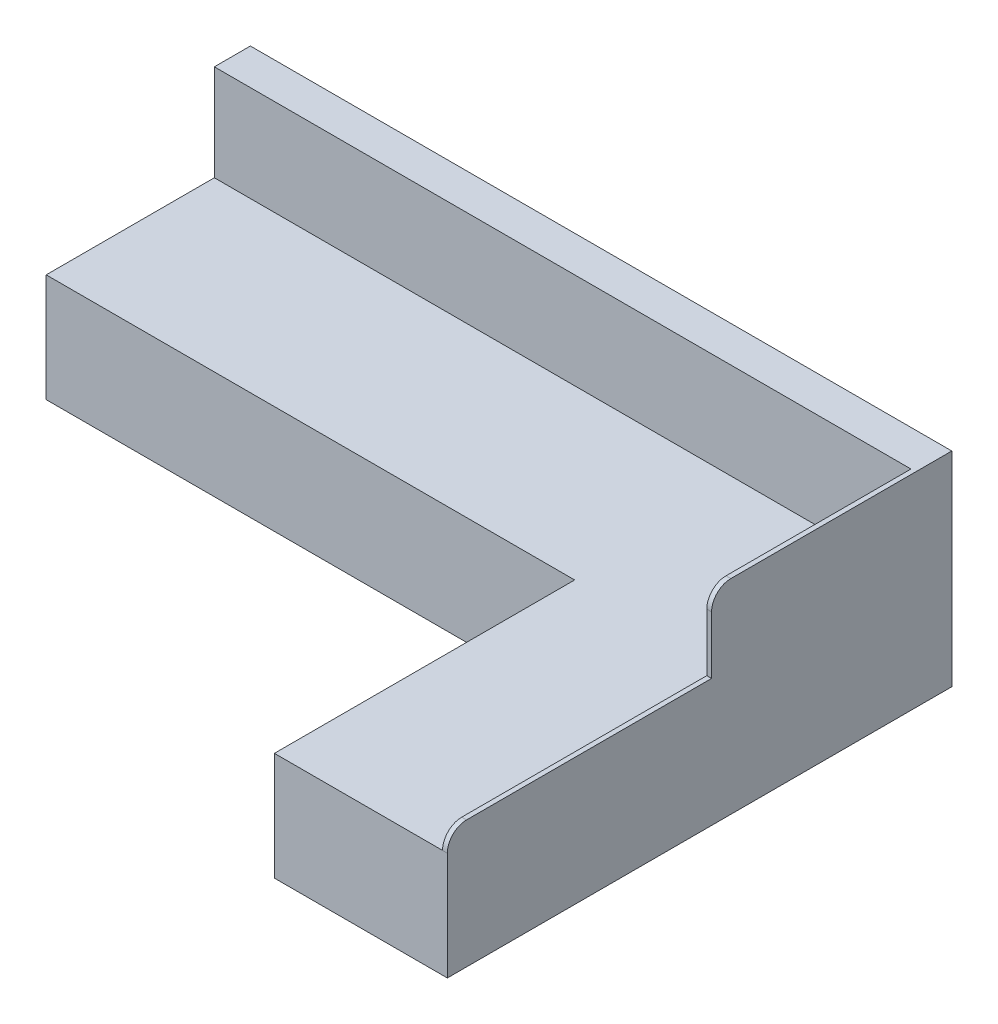
ISO-10303-21;
HEADER;
FILE_DESCRIPTION(('STEP AP214'),'2;1');
FILE_NAME('part.step','',(''),(''),'','','');
FILE_SCHEMA(('AUTOMOTIVE_DESIGN { 1 0 10303 214 1 1 1 1 }'));
ENDSEC;
DATA;
#1=APPLICATION_CONTEXT('core data for automotive mechanical design processes');
#2=APPLICATION_PROTOCOL_DEFINITION('international standard','automotive_design',2000,#1);
#3=PRODUCT_CONTEXT('',#1,'mechanical');
#4=PRODUCT('Part','Part','',(#3));
#5=PRODUCT_RELATED_PRODUCT_CATEGORY('part','',(#4));
#6=PRODUCT_DEFINITION_FORMATION('','',#4);
#7=PRODUCT_DEFINITION_CONTEXT('part definition',#1,'design');
#8=PRODUCT_DEFINITION('design','',#6,#7);
#9=PRODUCT_DEFINITION_SHAPE('','',#8);
#10=(LENGTH_UNIT() NAMED_UNIT(*) SI_UNIT(.MILLI.,.METRE.));
#11=(NAMED_UNIT(*) PLANE_ANGLE_UNIT() SI_UNIT($,.RADIAN.));
#12=(NAMED_UNIT(*) SI_UNIT($,.STERADIAN.) SOLID_ANGLE_UNIT());
#13=UNCERTAINTY_MEASURE_WITH_UNIT(LENGTH_MEASURE(1.E-05),#10,'distance_accuracy_value','');
#14=(GEOMETRIC_REPRESENTATION_CONTEXT(3) GLOBAL_UNCERTAINTY_ASSIGNED_CONTEXT((#13)) GLOBAL_UNIT_ASSIGNED_CONTEXT((#10,
#11,#12)) REPRESENTATION_CONTEXT('',''));
#15=CARTESIAN_POINT('',(0.,0.,0.));
#16=DIRECTION('',(0.,0.,1.));
#17=DIRECTION('',(1.,0.,0.));
#18=AXIS2_PLACEMENT_3D('',#15,#16,#17);
#19=CARTESIAN_POINT('',(0.,450.,0.));
#20=DIRECTION('',(0.,-1.,0.));
#21=DIRECTION('',(0.,0.,-1.));
#22=AXIS2_PLACEMENT_3D('',#19,#20,#21);
#23=PLANE('',#22);
#24=DIRECTION('',(1.,0.,0.));
#25=VECTOR('',#24,1.);
#26=CARTESIAN_POINT('',(-1450.,450.,-275.));
#27=LINE('',#26,#25);
#28=CARTESIAN_POINT('',(-1450.,450.,-275.));
#29=VERTEX_POINT('',#28);
#30=CARTESIAN_POINT('',(1450.,450.,-275.));
#31=VERTEX_POINT('',#30);
#32=EDGE_CURVE('E55',#29,#31,#27,.T.);
#33=ORIENTED_EDGE('',*,*,#32,.F.);
#34=DIRECTION('',(0.,0.,1.));
#35=VECTOR('',#34,1.);
#36=CARTESIAN_POINT('',(-1450.,450.,425.));
#37=LINE('',#36,#35);
#38=CARTESIAN_POINT('',(-1450.,450.,425.));
#39=VERTEX_POINT('',#38);
#40=EDGE_CURVE('E85',#29,#39,#37,.T.);
#41=ORIENTED_EDGE('',*,*,#40,.T.);
#42=DIRECTION('',(1.,0.,0.));
#43=VECTOR('',#42,1.);
#44=CARTESIAN_POINT('',(750.,450.,425.));
#45=LINE('',#44,#43);
#46=CARTESIAN_POINT('',(750.,450.,425.));
#47=VERTEX_POINT('',#46);
#48=EDGE_CURVE('E243',#39,#47,#45,.T.);
#49=ORIENTED_EDGE('',*,*,#48,.T.);
#50=DIRECTION('',(0.,0.,1.));
#51=VECTOR('',#50,1.);
#52=CARTESIAN_POINT('',(750.,450.,425.));
#53=LINE('',#52,#51);
#54=CARTESIAN_POINT('',(750.,450.,1675.));
#55=VERTEX_POINT('',#54);
#56=EDGE_CURVE('E63',#47,#55,#53,.T.);
#57=ORIENTED_EDGE('',*,*,#56,.T.);
#58=DIRECTION('',(1.,0.,0.));
#59=VECTOR('',#58,1.);
#60=CARTESIAN_POINT('',(1450.,450.,1675.));
#61=LINE('',#60,#59);
#62=CARTESIAN_POINT('',(1450.,449.999999999999,1675.));
#63=VERTEX_POINT('',#62);
#64=EDGE_CURVE('E248',#55,#63,#61,.T.);
#65=ORIENTED_EDGE('',*,*,#64,.T.);
#66=DIRECTION('',(0.,0.,-1.));
#67=VECTOR('',#66,1.);
#68=CARTESIAN_POINT('',(1450.,450.,-425.));
#69=LINE('',#68,#67);
#70=EDGE_CURVE('E251',#63,#31,#69,.T.);
#71=ORIENTED_EDGE('',*,*,#70,.T.);
#72=EDGE_LOOP('',(#33,#41,#49,#57,#65,#71));
#73=FACE_BOUND('',#72,.T.);
#74=ADVANCED_FACE('F39',(#73),#23,.F.);
#75=CARTESIAN_POINT('',(1450.,450.,-425.));
#76=DIRECTION('',(0.,0.,1.));
#77=DIRECTION('',(1.,0.,0.));
#78=AXIS2_PLACEMENT_3D('',#75,#76,#77);
#79=PLANE('',#78);
#80=DIRECTION('',(-1.,0.,0.));
#81=VECTOR('',#80,1.);
#82=CARTESIAN_POINT('',(1450.,0.,-425.));
#83=LINE('',#82,#81);
#84=CARTESIAN_POINT('',(1470.,0.,-425.));
#85=VERTEX_POINT('',#84);
#86=CARTESIAN_POINT('',(-1450.,0.,-425.));
#87=VERTEX_POINT('',#86);
#88=EDGE_CURVE('E155',#85,#87,#83,.T.);
#89=ORIENTED_EDGE('',*,*,#88,.T.);
#90=DIRECTION('',(0.,-1.,0.));
#91=VECTOR('',#90,1.);
#92=CARTESIAN_POINT('',(-1450.,450.,-425.));
#93=LINE('',#92,#91);
#94=CARTESIAN_POINT('',(-1450.,850.,-425.));
#95=VERTEX_POINT('',#94);
#96=EDGE_CURVE('E11',#95,#87,#93,.T.);
#97=ORIENTED_EDGE('',*,*,#96,.F.);
#98=DIRECTION('',(-1.,0.,0.));
#99=VECTOR('',#98,1.);
#100=CARTESIAN_POINT('',(-1450.,850.,-425.));
#101=LINE('',#100,#99);
#102=CARTESIAN_POINT('',(1470.,850.,-425.));
#103=VERTEX_POINT('',#102);
#104=EDGE_CURVE('E228',#103,#95,#101,.T.);
#105=ORIENTED_EDGE('',*,*,#104,.F.);
#106=DIRECTION('',(0.,1.,0.));
#107=VECTOR('',#106,1.);
#108=CARTESIAN_POINT('',(1470.,0.,-425.));
#109=LINE('',#108,#107);
#110=EDGE_CURVE('E160',#85,#103,#109,.T.);
#111=ORIENTED_EDGE('',*,*,#110,.F.);
#112=EDGE_LOOP('',(#89,#97,#105,#111));
#113=FACE_BOUND('',#112,.T.);
#114=ADVANCED_FACE('F41',(#113),#79,.F.);
#115=CARTESIAN_POINT('',(-1450.,450.,425.));
#116=DIRECTION('',(1.,0.,0.));
#117=DIRECTION('',(0.,0.,-1.));
#118=AXIS2_PLACEMENT_3D('',#115,#116,#117);
#119=PLANE('',#118);
#120=DIRECTION('',(0.,0.,1.));
#121=VECTOR('',#120,1.);
#122=CARTESIAN_POINT('',(-1450.,0.,425.));
#123=LINE('',#122,#121);
#124=CARTESIAN_POINT('',(-1450.,0.,425.));
#125=VERTEX_POINT('',#124);
#126=EDGE_CURVE('E256',#87,#125,#123,.T.);
#127=ORIENTED_EDGE('',*,*,#126,.T.);
#128=DIRECTION('',(0.,-1.,0.));
#129=VECTOR('',#128,1.);
#130=CARTESIAN_POINT('',(-1450.,450.,425.));
#131=LINE('',#130,#129);
#132=EDGE_CURVE('E48',#39,#125,#131,.T.);
#133=ORIENTED_EDGE('',*,*,#132,.F.);
#134=ORIENTED_EDGE('',*,*,#40,.F.);
#135=DIRECTION('',(0.,-1.,0.));
#136=VECTOR('',#135,1.);
#137=CARTESIAN_POINT('',(-1450.,850.,-275.));
#138=LINE('',#137,#136);
#139=CARTESIAN_POINT('',(-1450.,850.,-275.));
#140=VERTEX_POINT('',#139);
#141=EDGE_CURVE('E237',#140,#29,#138,.T.);
#142=ORIENTED_EDGE('',*,*,#141,.F.);
#143=DIRECTION('',(0.,0.,1.));
#144=VECTOR('',#143,1.);
#145=CARTESIAN_POINT('',(-1450.,850.,-425.));
#146=LINE('',#145,#144);
#147=EDGE_CURVE('E220',#95,#140,#146,.T.);
#148=ORIENTED_EDGE('',*,*,#147,.F.);
#149=ORIENTED_EDGE('',*,*,#96,.T.);
#150=EDGE_LOOP('',(#127,#133,#134,#142,#148,#149));
#151=FACE_BOUND('',#150,.T.);
#152=ADVANCED_FACE('F277',(#151),#119,.F.);
#153=CARTESIAN_POINT('',(750.,450.,425.));
#154=DIRECTION('',(0.,0.,-1.));
#155=DIRECTION('',(-1.,0.,0.));
#156=AXIS2_PLACEMENT_3D('',#153,#154,#155);
#157=PLANE('',#156);
#158=DIRECTION('',(1.,0.,0.));
#159=VECTOR('',#158,1.);
#160=CARTESIAN_POINT('',(750.,0.,425.));
#161=LINE('',#160,#159);
#162=CARTESIAN_POINT('',(750.,0.,425.));
#163=VERTEX_POINT('',#162);
#164=EDGE_CURVE('E259',#125,#163,#161,.T.);
#165=ORIENTED_EDGE('',*,*,#164,.T.);
#166=DIRECTION('',(0.,-1.,0.));
#167=VECTOR('',#166,1.);
#168=CARTESIAN_POINT('',(750.,450.,425.));
#169=LINE('',#168,#167);
#170=EDGE_CURVE('E266',#47,#163,#169,.T.);
#171=ORIENTED_EDGE('',*,*,#170,.F.);
#172=ORIENTED_EDGE('',*,*,#48,.F.);
#173=ORIENTED_EDGE('',*,*,#132,.T.);
#174=EDGE_LOOP('',(#165,#171,#172,#173));
#175=FACE_BOUND('',#174,.T.);
#176=ADVANCED_FACE('F273',(#175),#157,.F.);
#177=CARTESIAN_POINT('',(750.,450.,425.));
#178=DIRECTION('',(1.,0.,0.));
#179=DIRECTION('',(0.,0.,-1.));
#180=AXIS2_PLACEMENT_3D('',#177,#178,#179);
#181=PLANE('',#180);
#182=DIRECTION('',(0.,0.,1.));
#183=VECTOR('',#182,1.);
#184=CARTESIAN_POINT('',(750.,0.,425.));
#185=LINE('',#184,#183);
#186=CARTESIAN_POINT('',(750.,0.,1675.));
#187=VERTEX_POINT('',#186);
#188=EDGE_CURVE('E83',#163,#187,#185,.T.);
#189=ORIENTED_EDGE('',*,*,#188,.T.);
#190=DIRECTION('',(0.,-1.,0.));
#191=VECTOR('',#190,1.);
#192=CARTESIAN_POINT('',(750.,450.,1675.));
#193=LINE('',#192,#191);
#194=EDGE_CURVE('E147',#55,#187,#193,.T.);
#195=ORIENTED_EDGE('',*,*,#194,.F.);
#196=ORIENTED_EDGE('',*,*,#56,.F.);
#197=ORIENTED_EDGE('',*,*,#170,.T.);
#198=EDGE_LOOP('',(#189,#195,#196,#197));
#199=FACE_BOUND('',#198,.T.);
#200=ADVANCED_FACE('F328',(#199),#181,.F.);
#201=CARTESIAN_POINT('',(1450.,450.,1675.));
#202=DIRECTION('',(0.,0.,-1.));
#203=DIRECTION('',(-1.,0.,0.));
#204=AXIS2_PLACEMENT_3D('',#201,#202,#203);
#205=PLANE('',#204);
#206=DIRECTION('',(1.,0.,0.));
#207=VECTOR('',#206,1.);
#208=CARTESIAN_POINT('',(1450.,0.,1675.));
#209=LINE('',#208,#207);
#210=CARTESIAN_POINT('',(1470.,0.,1675.));
#211=VERTEX_POINT('',#210);
#212=EDGE_CURVE('E140',#187,#211,#209,.T.);
#213=ORIENTED_EDGE('',*,*,#212,.T.);
#214=DIRECTION('',(0.,-1.,0.));
#215=VECTOR('',#214,1.);
#216=CARTESIAN_POINT('',(1470.,0.,1675.));
#217=LINE('',#216,#215);
#218=CARTESIAN_POINT('',(1470.,449.999999999999,1675.));
#219=VERTEX_POINT('',#218);
#220=EDGE_CURVE('E145',#219,#211,#217,.T.);
#221=ORIENTED_EDGE('',*,*,#220,.F.);
#222=DIRECTION('',(-1.,0.,0.));
#223=VECTOR('',#222,1.);
#224=CARTESIAN_POINT('',(1470.,449.999999999999,1675.));
#225=LINE('',#224,#223);
#226=EDGE_CURVE('E190',#219,#63,#225,.T.);
#227=ORIENTED_EDGE('',*,*,#226,.T.);
#228=ORIENTED_EDGE('',*,*,#64,.F.);
#229=ORIENTED_EDGE('',*,*,#194,.T.);
#230=EDGE_LOOP('',(#213,#221,#227,#228,#229));
#231=FACE_BOUND('',#230,.T.);
#232=ADVANCED_FACE('F142',(#231),#205,.F.);
#233=CARTESIAN_POINT('',(0.,0.,0.));
#234=DIRECTION('',(0.,-1.,0.));
#235=DIRECTION('',(0.,0.,-1.));
#236=AXIS2_PLACEMENT_3D('',#233,#234,#235);
#237=PLANE('',#236);
#238=ORIENTED_EDGE('',*,*,#88,.F.);
#239=DIRECTION('',(0.,0.,-1.));
#240=VECTOR('',#239,1.);
#241=CARTESIAN_POINT('',(1470.,0.,1675.));
#242=LINE('',#241,#240);
#243=EDGE_CURVE('E152',#211,#85,#242,.T.);
#244=ORIENTED_EDGE('',*,*,#243,.F.);
#245=ORIENTED_EDGE('',*,*,#212,.F.);
#246=ORIENTED_EDGE('',*,*,#188,.F.);
#247=ORIENTED_EDGE('',*,*,#164,.F.);
#248=ORIENTED_EDGE('',*,*,#126,.F.);
#249=EDGE_LOOP('',(#238,#244,#245,#246,#247,#248));
#250=FACE_BOUND('',#249,.T.);
#251=ADVANCED_FACE('F153',(#250),#237,.T.);
#252=CARTESIAN_POINT('',(-1450.,850.,-275.));
#253=DIRECTION('',(0.,0.,-1.));
#254=DIRECTION('',(-1.,0.,0.));
#255=AXIS2_PLACEMENT_3D('',#252,#253,#254);
#256=PLANE('',#255);
#257=ORIENTED_EDGE('',*,*,#32,.T.);
#258=DIRECTION('',(0.,-1.,0.));
#259=VECTOR('',#258,1.);
#260=CARTESIAN_POINT('',(1450.,850.,-275.));
#261=LINE('',#260,#259);
#262=CARTESIAN_POINT('',(1450.,850.,-275.));
#263=VERTEX_POINT('',#262);
#264=EDGE_CURVE('E232',#263,#31,#261,.T.);
#265=ORIENTED_EDGE('',*,*,#264,.F.);
#266=DIRECTION('',(1.,0.,0.));
#267=VECTOR('',#266,1.);
#268=CARTESIAN_POINT('',(-1450.,850.,-275.));
#269=LINE('',#268,#267);
#270=EDGE_CURVE('E224',#140,#263,#269,.T.);
#271=ORIENTED_EDGE('',*,*,#270,.F.);
#272=ORIENTED_EDGE('',*,*,#141,.T.);
#273=EDGE_LOOP('',(#257,#265,#271,#272));
#274=FACE_BOUND('',#273,.T.);
#275=ADVANCED_FACE('F305',(#274),#256,.F.);
#276=CARTESIAN_POINT('',(0.,850.,0.));
#277=DIRECTION('',(0.,1.,0.));
#278=DIRECTION('',(0.,0.,1.));
#279=AXIS2_PLACEMENT_3D('',#276,#277,#278);
#280=PLANE('',#279);
#281=ORIENTED_EDGE('',*,*,#147,.T.);
#282=ORIENTED_EDGE('',*,*,#270,.T.);
#283=DIRECTION('',(0.,0.,1.));
#284=VECTOR('',#283,1.);
#285=CARTESIAN_POINT('',(1450.,850.,495.));
#286=LINE('',#285,#284);
#287=CARTESIAN_POINT('',(1450.,850.,495.));
#288=VERTEX_POINT('',#287);
#289=EDGE_CURVE('E191',#263,#288,#286,.T.);
#290=ORIENTED_EDGE('',*,*,#289,.T.);
#291=DIRECTION('',(-1.,0.,0.));
#292=VECTOR('',#291,1.);
#293=CARTESIAN_POINT('',(1470.,850.,495.));
#294=LINE('',#293,#292);
#295=CARTESIAN_POINT('',(1470.,850.,495.));
#296=VERTEX_POINT('',#295);
#297=EDGE_CURVE('E216',#296,#288,#294,.T.);
#298=ORIENTED_EDGE('',*,*,#297,.F.);
#299=DIRECTION('',(0.,0.,1.));
#300=VECTOR('',#299,1.);
#301=CARTESIAN_POINT('',(1470.,850.,495.));
#302=LINE('',#301,#300);
#303=EDGE_CURVE('E176',#103,#296,#302,.T.);
#304=ORIENTED_EDGE('',*,*,#303,.F.);
#305=ORIENTED_EDGE('',*,*,#104,.T.);
#306=EDGE_LOOP('',(#281,#282,#290,#298,#304,#305));
#307=FACE_BOUND('',#306,.T.);
#308=ADVANCED_FACE('F283',(#307),#280,.T.);
#309=CARTESIAN_POINT('',(1470.,770.,495.));
#310=DIRECTION('',(-1.,0.,0.));
#311=DIRECTION('',(0.,0.,1.));
#312=AXIS2_PLACEMENT_3D('',#309,#310,#311);
#313=CYLINDRICAL_SURFACE('',#312,80.);
#314=CARTESIAN_POINT('',(1450.,770.,495.));
#315=DIRECTION('',(1.,0.,0.));
#316=DIRECTION('',(0.,0.,-1.));
#317=AXIS2_PLACEMENT_3D('',#314,#315,#316);
#318=CIRCLE('',#317,80.);
#319=CARTESIAN_POINT('',(1450.,770.,575.));
#320=VERTEX_POINT('',#319);
#321=EDGE_CURVE('E194',#288,#320,#318,.T.);
#322=ORIENTED_EDGE('',*,*,#321,.T.);
#323=DIRECTION('',(-1.,0.,0.));
#324=VECTOR('',#323,1.);
#325=CARTESIAN_POINT('',(1470.,770.,575.));
#326=LINE('',#325,#324);
#327=CARTESIAN_POINT('',(1470.,770.,575.));
#328=VERTEX_POINT('',#327);
#329=EDGE_CURVE('E212',#328,#320,#326,.T.);
#330=ORIENTED_EDGE('',*,*,#329,.F.);
#331=CARTESIAN_POINT('',(1470.,770.,495.));
#332=DIRECTION('',(1.,0.,0.));
#333=DIRECTION('',(0.,0.,-1.));
#334=AXIS2_PLACEMENT_3D('',#331,#332,#333);
#335=CIRCLE('',#334,80.);
#336=EDGE_CURVE('E179',#296,#328,#335,.T.);
#337=ORIENTED_EDGE('',*,*,#336,.F.);
#338=ORIENTED_EDGE('',*,*,#297,.T.);
#339=EDGE_LOOP('',(#322,#330,#337,#338));
#340=FACE_BOUND('',#339,.T.);
#341=ADVANCED_FACE('F288',(#340),#313,.T.);
#342=CARTESIAN_POINT('',(1470.,770.,575.));
#343=DIRECTION('',(0.,0.,-1.));
#344=DIRECTION('',(-1.,0.,0.));
#345=AXIS2_PLACEMENT_3D('',#342,#343,#344);
#346=PLANE('',#345);
#347=DIRECTION('',(0.,-1.,0.));
#348=VECTOR('',#347,1.);
#349=CARTESIAN_POINT('',(1450.,770.,575.));
#350=LINE('',#349,#348);
#351=CARTESIAN_POINT('',(1450.,530.,575.));
#352=VERTEX_POINT('',#351);
#353=EDGE_CURVE('E197',#320,#352,#350,.T.);
#354=ORIENTED_EDGE('',*,*,#353,.T.);
#355=DIRECTION('',(-1.,0.,0.));
#356=VECTOR('',#355,1.);
#357=CARTESIAN_POINT('',(1470.,530.,575.));
#358=LINE('',#357,#356);
#359=CARTESIAN_POINT('',(1470.,530.,575.));
#360=VERTEX_POINT('',#359);
#361=EDGE_CURVE('E208',#360,#352,#358,.T.);
#362=ORIENTED_EDGE('',*,*,#361,.F.);
#363=DIRECTION('',(0.,-1.,0.));
#364=VECTOR('',#363,1.);
#365=CARTESIAN_POINT('',(1470.,770.,575.));
#366=LINE('',#365,#364);
#367=EDGE_CURVE('E182',#328,#360,#366,.T.);
#368=ORIENTED_EDGE('',*,*,#367,.F.);
#369=ORIENTED_EDGE('',*,*,#329,.T.);
#370=EDGE_LOOP('',(#354,#362,#368,#369));
#371=FACE_BOUND('',#370,.T.);
#372=ADVANCED_FACE('F294',(#371),#346,.F.);
#373=CARTESIAN_POINT('',(1470.,530.,575.));
#374=DIRECTION('',(0.,-1.,0.));
#375=DIRECTION('',(0.,0.,-1.));
#376=AXIS2_PLACEMENT_3D('',#373,#374,#375);
#377=PLANE('',#376);
#378=DIRECTION('',(0.,0.,1.));
#379=VECTOR('',#378,1.);
#380=CARTESIAN_POINT('',(1450.,530.,575.));
#381=LINE('',#380,#379);
#382=CARTESIAN_POINT('',(1450.,530.,1595.));
#383=VERTEX_POINT('',#382);
#384=EDGE_CURVE('E171',#352,#383,#381,.T.);
#385=ORIENTED_EDGE('',*,*,#384,.T.);
#386=DIRECTION('',(-1.,0.,0.));
#387=VECTOR('',#386,1.);
#388=CARTESIAN_POINT('',(1470.,530.,1595.));
#389=LINE('',#388,#387);
#390=CARTESIAN_POINT('',(1470.,530.,1595.));
#391=VERTEX_POINT('',#390);
#392=EDGE_CURVE('E204',#391,#383,#389,.T.);
#393=ORIENTED_EDGE('',*,*,#392,.F.);
#394=DIRECTION('',(0.,0.,1.));
#395=VECTOR('',#394,1.);
#396=CARTESIAN_POINT('',(1470.,530.,575.));
#397=LINE('',#396,#395);
#398=EDGE_CURVE('E185',#360,#391,#397,.T.);
#399=ORIENTED_EDGE('',*,*,#398,.F.);
#400=ORIENTED_EDGE('',*,*,#361,.T.);
#401=EDGE_LOOP('',(#385,#393,#399,#400));
#402=FACE_BOUND('',#401,.T.);
#403=ADVANCED_FACE('F298',(#402),#377,.F.);
#404=CARTESIAN_POINT('',(1470.,450.,1595.));
#405=DIRECTION('',(-1.,0.,0.));
#406=DIRECTION('',(0.,0.,1.));
#407=AXIS2_PLACEMENT_3D('',#404,#405,#406);
#408=CYLINDRICAL_SURFACE('',#407,80.);
#409=CARTESIAN_POINT('',(1450.,450.,1595.));
#410=DIRECTION('',(1.,0.,0.));
#411=DIRECTION('',(0.,0.,-1.));
#412=AXIS2_PLACEMENT_3D('',#409,#410,#411);
#413=CIRCLE('',#412,80.);
#414=EDGE_CURVE('E167',#383,#63,#413,.T.);
#415=ORIENTED_EDGE('',*,*,#414,.T.);
#416=ORIENTED_EDGE('',*,*,#226,.F.);
#417=CARTESIAN_POINT('',(1470.,450.,1595.));
#418=DIRECTION('',(1.,0.,0.));
#419=DIRECTION('',(0.,0.,-1.));
#420=AXIS2_PLACEMENT_3D('',#417,#418,#419);
#421=CIRCLE('',#420,80.);
#422=EDGE_CURVE('E164',#391,#219,#421,.T.);
#423=ORIENTED_EDGE('',*,*,#422,.F.);
#424=ORIENTED_EDGE('',*,*,#392,.T.);
#425=EDGE_LOOP('',(#415,#416,#423,#424));
#426=FACE_BOUND('',#425,.T.);
#427=ADVANCED_FACE('F301',(#426),#408,.T.);
#428=CARTESIAN_POINT('',(1470.,450.,1595.));
#429=DIRECTION('',(1.,0.,0.));
#430=DIRECTION('',(0.,0.,-1.));
#431=AXIS2_PLACEMENT_3D('',#428,#429,#430);
#432=PLANE('',#431);
#433=ORIENTED_EDGE('',*,*,#220,.T.);
#434=ORIENTED_EDGE('',*,*,#243,.T.);
#435=ORIENTED_EDGE('',*,*,#110,.T.);
#436=ORIENTED_EDGE('',*,*,#303,.T.);
#437=ORIENTED_EDGE('',*,*,#336,.T.);
#438=ORIENTED_EDGE('',*,*,#367,.T.);
#439=ORIENTED_EDGE('',*,*,#398,.T.);
#440=ORIENTED_EDGE('',*,*,#422,.T.);
#441=EDGE_LOOP('',(#433,#434,#435,#436,#437,#438,#439,#440));
#442=FACE_BOUND('',#441,.T.);
#443=ADVANCED_FACE('F162',(#442),#432,.T.);
#444=CARTESIAN_POINT('',(1450.,450.,1595.));
#445=DIRECTION('',(1.,0.,0.));
#446=DIRECTION('',(0.,0.,-1.));
#447=AXIS2_PLACEMENT_3D('',#444,#445,#446);
#448=PLANE('',#447);
#449=ORIENTED_EDGE('',*,*,#289,.F.);
#450=ORIENTED_EDGE('',*,*,#264,.T.);
#451=ORIENTED_EDGE('',*,*,#70,.F.);
#452=ORIENTED_EDGE('',*,*,#414,.F.);
#453=ORIENTED_EDGE('',*,*,#384,.F.);
#454=ORIENTED_EDGE('',*,*,#353,.F.);
#455=ORIENTED_EDGE('',*,*,#321,.F.);
#456=EDGE_LOOP('',(#449,#450,#451,#452,#453,#454,#455));
#457=FACE_BOUND('',#456,.T.);
#458=ADVANCED_FACE('F306',(#457),#448,.F.);
#459=CLOSED_SHELL('',(#74,#114,#152,#176,#200,#232,#251,#275,#308,#341,#372,#403,#427,#443,#458));
#460=MANIFOLD_SOLID_BREP('B2',#459);
#461=ADVANCED_BREP_SHAPE_REPRESENTATION('',(#18,#460),#14);
#462=SHAPE_DEFINITION_REPRESENTATION(#9,#461);
ENDSEC;
END-ISO-10303-21;
